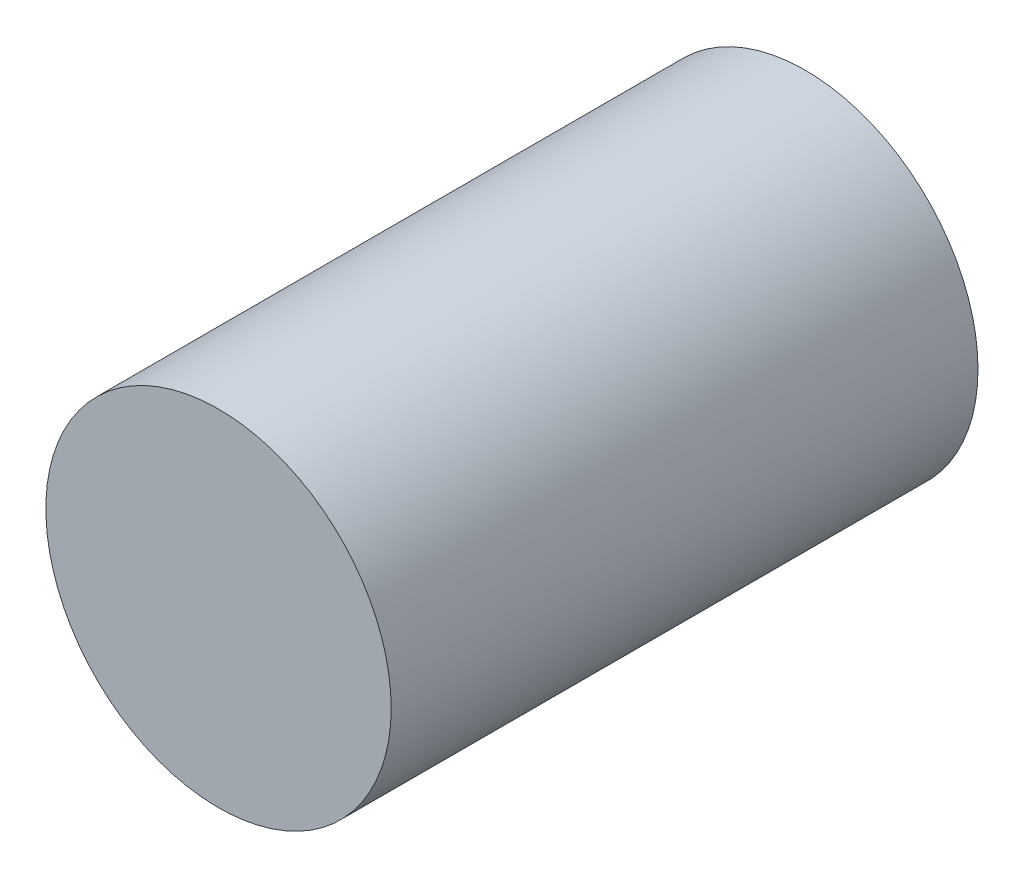
ISO-10303-21;
HEADER;
FILE_DESCRIPTION(('STEP AP214'),'2;1');
FILE_NAME('part.step','',(''),(''),'','','');
FILE_SCHEMA(('AUTOMOTIVE_DESIGN { 1 0 10303 214 1 1 1 1 }'));
ENDSEC;
DATA;
#1=APPLICATION_CONTEXT('core data for automotive mechanical design processes');
#2=APPLICATION_PROTOCOL_DEFINITION('international standard','automotive_design',2000,#1);
#3=PRODUCT_CONTEXT('',#1,'mechanical');
#4=PRODUCT('Part','Part','',(#3));
#5=PRODUCT_RELATED_PRODUCT_CATEGORY('part','',(#4));
#6=PRODUCT_DEFINITION_FORMATION('','',#4);
#7=PRODUCT_DEFINITION_CONTEXT('part definition',#1,'design');
#8=PRODUCT_DEFINITION('design','',#6,#7);
#9=PRODUCT_DEFINITION_SHAPE('','',#8);
#10=(LENGTH_UNIT() NAMED_UNIT(*) SI_UNIT(.MILLI.,.METRE.));
#11=(NAMED_UNIT(*) PLANE_ANGLE_UNIT() SI_UNIT($,.RADIAN.));
#12=(NAMED_UNIT(*) SI_UNIT($,.STERADIAN.) SOLID_ANGLE_UNIT());
#13=UNCERTAINTY_MEASURE_WITH_UNIT(LENGTH_MEASURE(1.E-05),#10,'distance_accuracy_value','');
#14=(GEOMETRIC_REPRESENTATION_CONTEXT(3) GLOBAL_UNCERTAINTY_ASSIGNED_CONTEXT((#13)) GLOBAL_UNIT_ASSIGNED_CONTEXT((#10,
#11,#12)) REPRESENTATION_CONTEXT('',''));
#15=CARTESIAN_POINT('',(0.,0.,0.));
#16=DIRECTION('',(0.,0.,1.));
#17=DIRECTION('',(1.,0.,0.));
#18=AXIS2_PLACEMENT_3D('',#15,#16,#17);
#19=CARTESIAN_POINT('',(0.,0.,-12.055));
#20=DIRECTION('',(0.,0.,1.));
#21=DIRECTION('',(1.,0.,0.));
#22=AXIS2_PLACEMENT_3D('',#19,#20,#21);
#23=CYLINDRICAL_SURFACE('',#22,6.35);
#24=CARTESIAN_POINT('',(0.,0.,-12.055));
#25=DIRECTION('',(0.,0.,1.));
#26=DIRECTION('',(1.,0.,0.));
#27=AXIS2_PLACEMENT_3D('',#24,#25,#26);
#28=CIRCLE('',#27,6.35);
#29=CARTESIAN_POINT('',(6.35,0.,-12.055));
#30=VERTEX_POINT('',#29);
#31=EDGE_CURVE('E11',#30,#30,#28,.T.);
#32=ORIENTED_EDGE('',*,*,#31,.T.);
#33=EDGE_LOOP('',(#32));
#34=FACE_BOUND('',#33,.T.);
#35=CARTESIAN_POINT('',(0.,0.,9.525));
#36=DIRECTION('',(0.,0.,1.));
#37=DIRECTION('',(1.,0.,0.));
#38=AXIS2_PLACEMENT_3D('',#35,#36,#37);
#39=CIRCLE('',#38,6.35);
#40=CARTESIAN_POINT('',(6.35,0.,9.525));
#41=VERTEX_POINT('',#40);
#42=EDGE_CURVE('E46',#41,#41,#39,.T.);
#43=ORIENTED_EDGE('',*,*,#42,.F.);
#44=EDGE_LOOP('',(#43));
#45=FACE_BOUND('',#44,.T.);
#46=ADVANCED_FACE('F43',(#34,#45),#23,.T.);
#47=CARTESIAN_POINT('',(0.,0.,-12.055));
#48=DIRECTION('',(0.,0.,1.));
#49=DIRECTION('',(1.,0.,0.));
#50=AXIS2_PLACEMENT_3D('',#47,#48,#49);
#51=PLANE('',#50);
#52=CARTESIAN_POINT('',(1.9558,0.,-12.055));
#53=DIRECTION('',(0.,0.,-1.));
#54=DIRECTION('',(-1.,0.,0.));
#55=AXIS2_PLACEMENT_3D('',#52,#53,#54);
#56=CIRCLE('',#55,1.8415);
#57=CARTESIAN_POINT('',(1.9558,1.8415,-12.055));
#58=VERTEX_POINT('',#57);
#59=CARTESIAN_POINT('',(1.9558,-1.8415,-12.055));
#60=VERTEX_POINT('',#59);
#61=EDGE_CURVE('E105',#58,#60,#56,.T.);
#62=ORIENTED_EDGE('',*,*,#61,.F.);
#63=DIRECTION('',(1.,0.,0.));
#64=VECTOR('',#63,1.);
#65=CARTESIAN_POINT('',(1.9558,1.8415,-12.055));
#66=LINE('',#65,#64);
#67=CARTESIAN_POINT('',(-1.9558,1.8415,-12.055));
#68=VERTEX_POINT('',#67);
#69=EDGE_CURVE('E99',#68,#58,#66,.T.);
#70=ORIENTED_EDGE('',*,*,#69,.F.);
#71=CARTESIAN_POINT('',(-1.9558,0.,-12.055));
#72=DIRECTION('',(0.,0.,-1.));
#73=DIRECTION('',(1.,0.,0.));
#74=AXIS2_PLACEMENT_3D('',#71,#72,#73);
#75=CIRCLE('',#74,1.8415);
#76=CARTESIAN_POINT('',(-1.9558,-1.8415,-12.055));
#77=VERTEX_POINT('',#76);
#78=EDGE_CURVE('E109',#77,#68,#75,.T.);
#79=ORIENTED_EDGE('',*,*,#78,.F.);
#80=DIRECTION('',(-1.,0.,0.));
#81=VECTOR('',#80,1.);
#82=CARTESIAN_POINT('',(1.9558,-1.8415,-12.055));
#83=LINE('',#82,#81);
#84=EDGE_CURVE('E57',#60,#77,#83,.T.);
#85=ORIENTED_EDGE('',*,*,#84,.F.);
#86=EDGE_LOOP('',(#62,#70,#79,#85));
#87=FACE_BOUND('',#86,.T.);
#88=ORIENTED_EDGE('',*,*,#31,.F.);
#89=EDGE_LOOP('',(#88));
#90=FACE_BOUND('',#89,.T.);
#91=ADVANCED_FACE('F123',(#87,#90),#51,.F.);
#92=CARTESIAN_POINT('',(0.,0.,9.525));
#93=DIRECTION('',(0.,0.,1.));
#94=DIRECTION('',(1.,0.,0.));
#95=AXIS2_PLACEMENT_3D('',#92,#93,#94);
#96=PLANE('',#95);
#97=ORIENTED_EDGE('',*,*,#42,.T.);
#98=EDGE_LOOP('',(#97));
#99=FACE_BOUND('',#98,.T.);
#100=ADVANCED_FACE('F120',(#99),#96,.T.);
#101=CARTESIAN_POINT('',(0.,0.,3.175));
#102=DIRECTION('',(0.,0.,1.));
#103=DIRECTION('',(1.,0.,0.));
#104=AXIS2_PLACEMENT_3D('',#101,#102,#103);
#105=PLANE('',#104);
#106=CARTESIAN_POINT('',(-1.9558,0.,3.175));
#107=DIRECTION('',(0.,0.,1.));
#108=DIRECTION('',(1.,0.,0.));
#109=AXIS2_PLACEMENT_3D('',#106,#107,#108);
#110=CIRCLE('',#109,1.8415);
#111=CARTESIAN_POINT('',(-1.9558,-1.8415,3.175));
#112=VERTEX_POINT('',#111);
#113=CARTESIAN_POINT('',(-1.9558,1.8415,3.175));
#114=VERTEX_POINT('',#113);
#115=EDGE_CURVE('E103',#112,#114,#110,.F.);
#116=ORIENTED_EDGE('',*,*,#115,.T.);
#117=DIRECTION('',(1.,0.,0.));
#118=VECTOR('',#117,1.);
#119=CARTESIAN_POINT('',(1.9558,1.8415,3.175));
#120=LINE('',#119,#118);
#121=CARTESIAN_POINT('',(1.9558,1.8415,3.175));
#122=VERTEX_POINT('',#121);
#123=EDGE_CURVE('E81',#114,#122,#120,.T.);
#124=ORIENTED_EDGE('',*,*,#123,.T.);
#125=CARTESIAN_POINT('',(1.9558,0.,3.175));
#126=DIRECTION('',(0.,0.,1.));
#127=DIRECTION('',(1.,0.,0.));
#128=AXIS2_PLACEMENT_3D('',#125,#126,#127);
#129=CIRCLE('',#128,1.8415);
#130=CARTESIAN_POINT('',(1.9558,-1.8415,3.175));
#131=VERTEX_POINT('',#130);
#132=EDGE_CURVE('E89',#122,#131,#129,.F.);
#133=ORIENTED_EDGE('',*,*,#132,.T.);
#134=DIRECTION('',(-1.,0.,0.));
#135=VECTOR('',#134,1.);
#136=CARTESIAN_POINT('',(1.9558,-1.8415,3.175));
#137=LINE('',#136,#135);
#138=EDGE_CURVE('E113',#131,#112,#137,.T.);
#139=ORIENTED_EDGE('',*,*,#138,.T.);
#140=EDGE_LOOP('',(#116,#124,#133,#139));
#141=FACE_BOUND('',#140,.T.);
#142=ADVANCED_FACE('F102',(#141),#105,.F.);
#143=CARTESIAN_POINT('',(1.9558,1.8415,11.615523571438));
#144=DIRECTION('',(0.,1.,0.));
#145=DIRECTION('',(-1.,0.,0.));
#146=AXIS2_PLACEMENT_3D('',#143,#144,#145);
#147=PLANE('',#146);
#148=DIRECTION('',(0.,0.,-1.));
#149=VECTOR('',#148,1.);
#150=CARTESIAN_POINT('',(-1.9558,1.8415,11.615523571438));
#151=LINE('',#150,#149);
#152=EDGE_CURVE('E66',#114,#68,#151,.T.);
#153=ORIENTED_EDGE('',*,*,#152,.T.);
#154=ORIENTED_EDGE('',*,*,#69,.T.);
#155=DIRECTION('',(0.,0.,-1.));
#156=VECTOR('',#155,1.);
#157=CARTESIAN_POINT('',(1.9558,1.8415,11.615523571438));
#158=LINE('',#157,#156);
#159=EDGE_CURVE('E92',#122,#58,#158,.T.);
#160=ORIENTED_EDGE('',*,*,#159,.F.);
#161=ORIENTED_EDGE('',*,*,#123,.F.);
#162=EDGE_LOOP('',(#153,#154,#160,#161));
#163=FACE_BOUND('',#162,.T.);
#164=ADVANCED_FACE('F97',(#163),#147,.F.);
#165=CARTESIAN_POINT('',(1.9558,0.,11.615523571438));
#166=DIRECTION('',(0.,0.,-1.));
#167=DIRECTION('',(-1.,0.,0.));
#168=AXIS2_PLACEMENT_3D('',#165,#166,#167);
#169=CYLINDRICAL_SURFACE('',#168,1.8415);
#170=ORIENTED_EDGE('',*,*,#159,.T.);
#171=ORIENTED_EDGE('',*,*,#61,.T.);
#172=DIRECTION('',(0.,0.,-1.));
#173=VECTOR('',#172,1.);
#174=CARTESIAN_POINT('',(1.9558,-1.8415,11.615523571438));
#175=LINE('',#174,#173);
#176=EDGE_CURVE('E93',#131,#60,#175,.T.);
#177=ORIENTED_EDGE('',*,*,#176,.F.);
#178=ORIENTED_EDGE('',*,*,#132,.F.);
#179=EDGE_LOOP('',(#170,#171,#177,#178));
#180=FACE_BOUND('',#179,.T.);
#181=ADVANCED_FACE('F90',(#180),#169,.F.);
#182=CARTESIAN_POINT('',(1.9558,-1.8415,11.615523571438));
#183=DIRECTION('',(0.,-1.,0.));
#184=DIRECTION('',(1.,0.,0.));
#185=AXIS2_PLACEMENT_3D('',#182,#183,#184);
#186=PLANE('',#185);
#187=ORIENTED_EDGE('',*,*,#176,.T.);
#188=ORIENTED_EDGE('',*,*,#84,.T.);
#189=DIRECTION('',(0.,0.,-1.));
#190=VECTOR('',#189,1.);
#191=CARTESIAN_POINT('',(-1.9558,-1.8415,11.615523571438));
#192=LINE('',#191,#190);
#193=EDGE_CURVE('E112',#112,#77,#192,.T.);
#194=ORIENTED_EDGE('',*,*,#193,.F.);
#195=ORIENTED_EDGE('',*,*,#138,.F.);
#196=EDGE_LOOP('',(#187,#188,#194,#195));
#197=FACE_BOUND('',#196,.T.);
#198=ADVANCED_FACE('F144',(#197),#186,.F.);
#199=CARTESIAN_POINT('',(-1.9558,0.,11.615523571438));
#200=DIRECTION('',(0.,0.,-1.));
#201=DIRECTION('',(-1.,0.,0.));
#202=AXIS2_PLACEMENT_3D('',#199,#200,#201);
#203=CYLINDRICAL_SURFACE('',#202,1.8415);
#204=ORIENTED_EDGE('',*,*,#193,.T.);
#205=ORIENTED_EDGE('',*,*,#78,.T.);
#206=ORIENTED_EDGE('',*,*,#152,.F.);
#207=ORIENTED_EDGE('',*,*,#115,.F.);
#208=EDGE_LOOP('',(#204,#205,#206,#207));
#209=FACE_BOUND('',#208,.T.);
#210=ADVANCED_FACE('F147',(#209),#203,.F.);
#211=CLOSED_SHELL('',(#46,#91,#100,#142,#164,#181,#198,#210));
#212=MANIFOLD_SOLID_BREP('B2',#211);
#213=ADVANCED_BREP_SHAPE_REPRESENTATION('',(#18,#212),#14);
#214=SHAPE_DEFINITION_REPRESENTATION(#9,#213);
ENDSEC;
END-ISO-10303-21;
